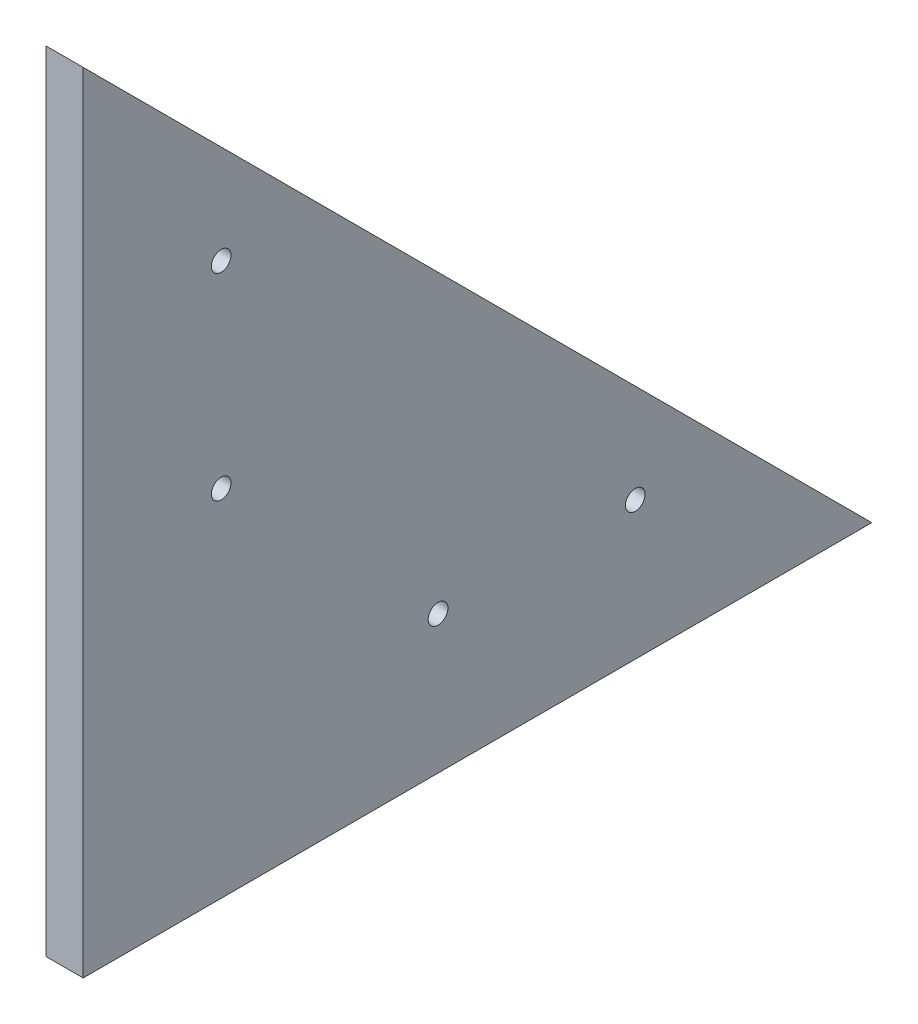
ISO-10303-21;
HEADER;
FILE_DESCRIPTION(('STEP AP214'),'2;1');
FILE_NAME('part.step','',(''),(''),'','','');
FILE_SCHEMA(('AUTOMOTIVE_DESIGN { 1 0 10303 214 1 1 1 1 }'));
ENDSEC;
DATA;
#1=APPLICATION_CONTEXT('core data for automotive mechanical design processes');
#2=APPLICATION_PROTOCOL_DEFINITION('international standard','automotive_design',2000,#1);
#3=PRODUCT_CONTEXT('',#1,'mechanical');
#4=PRODUCT('Part','Part','',(#3));
#5=PRODUCT_RELATED_PRODUCT_CATEGORY('part','',(#4));
#6=PRODUCT_DEFINITION_FORMATION('','',#4);
#7=PRODUCT_DEFINITION_CONTEXT('part definition',#1,'design');
#8=PRODUCT_DEFINITION('design','',#6,#7);
#9=PRODUCT_DEFINITION_SHAPE('','',#8);
#10=(LENGTH_UNIT() NAMED_UNIT(*) SI_UNIT(.MILLI.,.METRE.));
#11=(NAMED_UNIT(*) PLANE_ANGLE_UNIT() SI_UNIT($,.RADIAN.));
#12=(NAMED_UNIT(*) SI_UNIT($,.STERADIAN.) SOLID_ANGLE_UNIT());
#13=UNCERTAINTY_MEASURE_WITH_UNIT(LENGTH_MEASURE(1.E-05),#10,'distance_accuracy_value','');
#14=(GEOMETRIC_REPRESENTATION_CONTEXT(3) GLOBAL_UNCERTAINTY_ASSIGNED_CONTEXT((#13)) GLOBAL_UNIT_ASSIGNED_CONTEXT((#10,
#11,#12)) REPRESENTATION_CONTEXT('',''));
#15=CARTESIAN_POINT('',(0.,0.,0.));
#16=DIRECTION('',(0.,0.,1.));
#17=DIRECTION('',(1.,0.,0.));
#18=AXIS2_PLACEMENT_3D('',#15,#16,#17);
#19=CARTESIAN_POINT('',(11.90625,0.,-254.));
#20=DIRECTION('',(0.,1.,0.));
#21=DIRECTION('',(0.,0.,1.));
#22=AXIS2_PLACEMENT_3D('',#19,#20,#21);
#23=PLANE('',#22);
#24=DIRECTION('',(0.,0.,-1.));
#25=VECTOR('',#24,1.);
#26=CARTESIAN_POINT('',(0.,0.,-254.));
#27=LINE('',#26,#25);
#28=CARTESIAN_POINT('',(0.,0.,0.));
#29=VERTEX_POINT('',#28);
#30=CARTESIAN_POINT('',(0.,0.,-254.));
#31=VERTEX_POINT('',#30);
#32=EDGE_CURVE('E79',#29,#31,#27,.T.);
#33=ORIENTED_EDGE('',*,*,#32,.T.);
#34=DIRECTION('',(-1.,0.,0.));
#35=VECTOR('',#34,1.);
#36=CARTESIAN_POINT('',(11.90625,0.,-254.));
#37=LINE('',#36,#35);
#38=CARTESIAN_POINT('',(11.90625,0.,-254.));
#39=VERTEX_POINT('',#38);
#40=EDGE_CURVE('E11',#39,#31,#37,.T.);
#41=ORIENTED_EDGE('',*,*,#40,.F.);
#42=DIRECTION('',(0.,0.,-1.));
#43=VECTOR('',#42,1.);
#44=CARTESIAN_POINT('',(11.90625,0.,-254.));
#45=LINE('',#44,#43);
#46=CARTESIAN_POINT('',(11.90625,0.,0.));
#47=VERTEX_POINT('',#46);
#48=EDGE_CURVE('E72',#47,#39,#45,.T.);
#49=ORIENTED_EDGE('',*,*,#48,.F.);
#50=DIRECTION('',(-1.,0.,0.));
#51=VECTOR('',#50,1.);
#52=CARTESIAN_POINT('',(11.90625,0.,0.));
#53=LINE('',#52,#51);
#54=EDGE_CURVE('E80',#47,#29,#53,.T.);
#55=ORIENTED_EDGE('',*,*,#54,.T.);
#56=EDGE_LOOP('',(#33,#41,#49,#55));
#57=FACE_BOUND('',#56,.T.);
#58=ADVANCED_FACE('F32',(#57),#23,.F.);
#59=CARTESIAN_POINT('',(11.90625,254.,0.));
#60=DIRECTION('',(0.,-0.707106781186548,0.707106781186547));
#61=DIRECTION('',(0.,-0.707106781186547,-0.707106781186548));
#62=AXIS2_PLACEMENT_3D('',#59,#60,#61);
#63=PLANE('',#62);
#64=DIRECTION('',(0.,0.707106781186547,0.707106781186548));
#65=VECTOR('',#64,1.);
#66=CARTESIAN_POINT('',(0.,254.,0.));
#67=LINE('',#66,#65);
#68=CARTESIAN_POINT('',(0.,254.,0.));
#69=VERTEX_POINT('',#68);
#70=EDGE_CURVE('E60',#31,#69,#67,.T.);
#71=ORIENTED_EDGE('',*,*,#70,.T.);
#72=DIRECTION('',(-1.,0.,0.));
#73=VECTOR('',#72,1.);
#74=CARTESIAN_POINT('',(11.90625,254.,0.));
#75=LINE('',#74,#73);
#76=CARTESIAN_POINT('',(11.90625,254.,0.));
#77=VERTEX_POINT('',#76);
#78=EDGE_CURVE('E40',#77,#69,#75,.T.);
#79=ORIENTED_EDGE('',*,*,#78,.F.);
#80=DIRECTION('',(0.,0.707106781186547,0.707106781186548));
#81=VECTOR('',#80,1.);
#82=CARTESIAN_POINT('',(11.90625,254.,0.));
#83=LINE('',#82,#81);
#84=EDGE_CURVE('E68',#39,#77,#83,.T.);
#85=ORIENTED_EDGE('',*,*,#84,.F.);
#86=ORIENTED_EDGE('',*,*,#40,.T.);
#87=EDGE_LOOP('',(#71,#79,#85,#86));
#88=FACE_BOUND('',#87,.T.);
#89=ADVANCED_FACE('F69',(#88),#63,.F.);
#90=CARTESIAN_POINT('',(11.90625,0.,0.));
#91=DIRECTION('',(0.,0.,-1.));
#92=DIRECTION('',(-1.,0.,0.));
#93=AXIS2_PLACEMENT_3D('',#90,#91,#92);
#94=PLANE('',#93);
#95=DIRECTION('',(0.,-1.,0.));
#96=VECTOR('',#95,1.);
#97=CARTESIAN_POINT('',(0.,0.,0.));
#98=LINE('',#97,#96);
#99=EDGE_CURVE('E65',#69,#29,#98,.T.);
#100=ORIENTED_EDGE('',*,*,#99,.T.);
#101=ORIENTED_EDGE('',*,*,#54,.F.);
#102=DIRECTION('',(0.,-1.,0.));
#103=VECTOR('',#102,1.);
#104=CARTESIAN_POINT('',(11.90625,0.,0.));
#105=LINE('',#104,#103);
#106=EDGE_CURVE('E48',#77,#47,#105,.T.);
#107=ORIENTED_EDGE('',*,*,#106,.F.);
#108=ORIENTED_EDGE('',*,*,#78,.T.);
#109=EDGE_LOOP('',(#100,#101,#107,#108));
#110=FACE_BOUND('',#109,.T.);
#111=ADVANCED_FACE('F91',(#110),#94,.F.);
#112=CARTESIAN_POINT('',(11.90625,0.,0.));
#113=DIRECTION('',(-1.,0.,0.));
#114=DIRECTION('',(0.,0.,1.));
#115=AXIS2_PLACEMENT_3D('',#112,#113,#114);
#116=PLANE('',#115);
#117=CARTESIAN_POINT('',(11.90625,44.45,-114.3));
#118=DIRECTION('',(-1.,0.,0.));
#119=DIRECTION('',(0.,0.,1.));
#120=AXIS2_PLACEMENT_3D('',#117,#118,#119);
#121=CIRCLE('',#120,3.17499999999999);
#122=CARTESIAN_POINT('',(11.90625,44.45,-111.125));
#123=VERTEX_POINT('',#122);
#124=EDGE_CURVE('E168',#123,#123,#121,.T.);
#125=ORIENTED_EDGE('',*,*,#124,.T.);
#126=EDGE_LOOP('',(#125));
#127=FACE_BOUND('',#126,.T.);
#128=CARTESIAN_POINT('',(11.90625,114.3,-44.45));
#129=DIRECTION('',(-1.,0.,0.));
#130=DIRECTION('',(0.,0.,1.));
#131=AXIS2_PLACEMENT_3D('',#128,#129,#130);
#132=CIRCLE('',#131,3.175);
#133=CARTESIAN_POINT('',(11.90625,114.3,-41.275));
#134=VERTEX_POINT('',#133);
#135=EDGE_CURVE('E177',#134,#134,#132,.T.);
#136=ORIENTED_EDGE('',*,*,#135,.T.);
#137=EDGE_LOOP('',(#136));
#138=FACE_BOUND('',#137,.T.);
#139=CARTESIAN_POINT('',(11.90625,177.8,-44.45));
#140=DIRECTION('',(-1.,0.,0.));
#141=DIRECTION('',(0.,0.,1.));
#142=AXIS2_PLACEMENT_3D('',#139,#140,#141);
#143=CIRCLE('',#142,3.17499999999998);
#144=CARTESIAN_POINT('',(11.90625,177.8,-41.275));
#145=VERTEX_POINT('',#144);
#146=EDGE_CURVE('E183',#145,#145,#143,.T.);
#147=ORIENTED_EDGE('',*,*,#146,.T.);
#148=EDGE_LOOP('',(#147));
#149=FACE_BOUND('',#148,.T.);
#150=CARTESIAN_POINT('',(11.90625,44.45,-177.8));
#151=DIRECTION('',(-1.,0.,0.));
#152=DIRECTION('',(0.,0.,1.));
#153=AXIS2_PLACEMENT_3D('',#150,#151,#152);
#154=CIRCLE('',#153,3.17499999999999);
#155=CARTESIAN_POINT('',(11.90625,44.45,-174.625));
#156=VERTEX_POINT('',#155);
#157=EDGE_CURVE('E82',#156,#156,#154,.T.);
#158=ORIENTED_EDGE('',*,*,#157,.T.);
#159=EDGE_LOOP('',(#158));
#160=FACE_BOUND('',#159,.T.);
#161=ORIENTED_EDGE('',*,*,#48,.T.);
#162=ORIENTED_EDGE('',*,*,#84,.T.);
#163=ORIENTED_EDGE('',*,*,#106,.T.);
#164=EDGE_LOOP('',(#161,#162,#163));
#165=FACE_BOUND('',#164,.T.);
#166=ADVANCED_FACE('F75',(#127,#138,#149,#160,#165),#116,.F.);
#167=CARTESIAN_POINT('',(0.,0.,0.));
#168=DIRECTION('',(-1.,0.,0.));
#169=DIRECTION('',(0.,0.,1.));
#170=AXIS2_PLACEMENT_3D('',#167,#168,#169);
#171=PLANE('',#170);
#172=CARTESIAN_POINT('',(0.,44.45,-114.3));
#173=DIRECTION('',(-1.,0.,0.));
#174=DIRECTION('',(0.,0.,1.));
#175=AXIS2_PLACEMENT_3D('',#172,#173,#174);
#176=CIRCLE('',#175,3.17499999999999);
#177=CARTESIAN_POINT('',(0.,44.45,-111.125));
#178=VERTEX_POINT('',#177);
#179=EDGE_CURVE('E170',#178,#178,#176,.T.);
#180=ORIENTED_EDGE('',*,*,#179,.F.);
#181=EDGE_LOOP('',(#180));
#182=FACE_BOUND('',#181,.T.);
#183=CARTESIAN_POINT('',(0.,114.3,-44.45));
#184=DIRECTION('',(-1.,0.,0.));
#185=DIRECTION('',(0.,0.,1.));
#186=AXIS2_PLACEMENT_3D('',#183,#184,#185);
#187=CIRCLE('',#186,3.17499999999998);
#188=CARTESIAN_POINT('',(0.,114.3,-41.275));
#189=VERTEX_POINT('',#188);
#190=EDGE_CURVE('E172',#189,#189,#187,.T.);
#191=ORIENTED_EDGE('',*,*,#190,.F.);
#192=EDGE_LOOP('',(#191));
#193=FACE_BOUND('',#192,.T.);
#194=CARTESIAN_POINT('',(0.,177.8,-44.45));
#195=DIRECTION('',(-1.,0.,0.));
#196=DIRECTION('',(0.,0.,1.));
#197=AXIS2_PLACEMENT_3D('',#194,#195,#196);
#198=CIRCLE('',#197,3.17499999999998);
#199=CARTESIAN_POINT('',(0.,177.8,-41.275));
#200=VERTEX_POINT('',#199);
#201=EDGE_CURVE('E180',#200,#200,#198,.T.);
#202=ORIENTED_EDGE('',*,*,#201,.F.);
#203=EDGE_LOOP('',(#202));
#204=FACE_BOUND('',#203,.T.);
#205=CARTESIAN_POINT('',(0.,44.45,-177.8));
#206=DIRECTION('',(-1.,0.,0.));
#207=DIRECTION('',(0.,0.,1.));
#208=AXIS2_PLACEMENT_3D('',#205,#206,#207);
#209=CIRCLE('',#208,3.17499999999999);
#210=CARTESIAN_POINT('',(0.,44.45,-174.625));
#211=VERTEX_POINT('',#210);
#212=EDGE_CURVE('E86',#211,#211,#209,.T.);
#213=ORIENTED_EDGE('',*,*,#212,.F.);
#214=EDGE_LOOP('',(#213));
#215=FACE_BOUND('',#214,.T.);
#216=ORIENTED_EDGE('',*,*,#32,.F.);
#217=ORIENTED_EDGE('',*,*,#99,.F.);
#218=ORIENTED_EDGE('',*,*,#70,.F.);
#219=EDGE_LOOP('',(#216,#217,#218));
#220=FACE_BOUND('',#219,.T.);
#221=ADVANCED_FACE('F92',(#182,#193,#204,#215,#220),#171,.T.);
#222=CARTESIAN_POINT('',(0.,44.45,-177.8));
#223=DIRECTION('',(-1.,0.,0.));
#224=DIRECTION('',(0.,0.,1.));
#225=AXIS2_PLACEMENT_3D('',#222,#223,#224);
#226=CYLINDRICAL_SURFACE('',#225,3.17499999999999);
#227=ORIENTED_EDGE('',*,*,#157,.F.);
#228=EDGE_LOOP('',(#227));
#229=FACE_BOUND('',#228,.T.);
#230=ORIENTED_EDGE('',*,*,#212,.T.);
#231=EDGE_LOOP('',(#230));
#232=FACE_BOUND('',#231,.T.);
#233=ADVANCED_FACE('F94',(#229,#232),#226,.F.);
#234=CARTESIAN_POINT('',(0.,177.8,-44.45));
#235=DIRECTION('',(-1.,0.,0.));
#236=DIRECTION('',(0.,0.,1.));
#237=AXIS2_PLACEMENT_3D('',#234,#235,#236);
#238=CYLINDRICAL_SURFACE('',#237,3.17499999999998);
#239=ORIENTED_EDGE('',*,*,#146,.F.);
#240=EDGE_LOOP('',(#239));
#241=FACE_BOUND('',#240,.T.);
#242=ORIENTED_EDGE('',*,*,#201,.T.);
#243=EDGE_LOOP('',(#242));
#244=FACE_BOUND('',#243,.T.);
#245=ADVANCED_FACE('F101',(#241,#244),#238,.F.);
#246=CARTESIAN_POINT('',(0.,114.3,-44.45));
#247=DIRECTION('',(-1.,0.,0.));
#248=DIRECTION('',(0.,0.,1.));
#249=AXIS2_PLACEMENT_3D('',#246,#247,#248);
#250=CYLINDRICAL_SURFACE('',#249,3.17499999999999);
#251=ORIENTED_EDGE('',*,*,#135,.F.);
#252=EDGE_LOOP('',(#251));
#253=FACE_BOUND('',#252,.T.);
#254=ORIENTED_EDGE('',*,*,#190,.T.);
#255=EDGE_LOOP('',(#254));
#256=FACE_BOUND('',#255,.T.);
#257=ADVANCED_FACE('F141',(#253,#256),#250,.F.);
#258=CARTESIAN_POINT('',(0.,44.45,-114.3));
#259=DIRECTION('',(-1.,0.,0.));
#260=DIRECTION('',(0.,0.,1.));
#261=AXIS2_PLACEMENT_3D('',#258,#259,#260);
#262=CYLINDRICAL_SURFACE('',#261,3.17499999999999);
#263=ORIENTED_EDGE('',*,*,#124,.F.);
#264=EDGE_LOOP('',(#263));
#265=FACE_BOUND('',#264,.T.);
#266=ORIENTED_EDGE('',*,*,#179,.T.);
#267=EDGE_LOOP('',(#266));
#268=FACE_BOUND('',#267,.T.);
#269=ADVANCED_FACE('F151',(#265,#268),#262,.F.);
#270=CLOSED_SHELL('',(#58,#89,#111,#166,#221,#233,#245,#257,#269));
#271=MANIFOLD_SOLID_BREP('B2',#270);
#272=ADVANCED_BREP_SHAPE_REPRESENTATION('',(#18,#271),#14);
#273=SHAPE_DEFINITION_REPRESENTATION(#9,#272);
ENDSEC;
END-ISO-10303-21;
